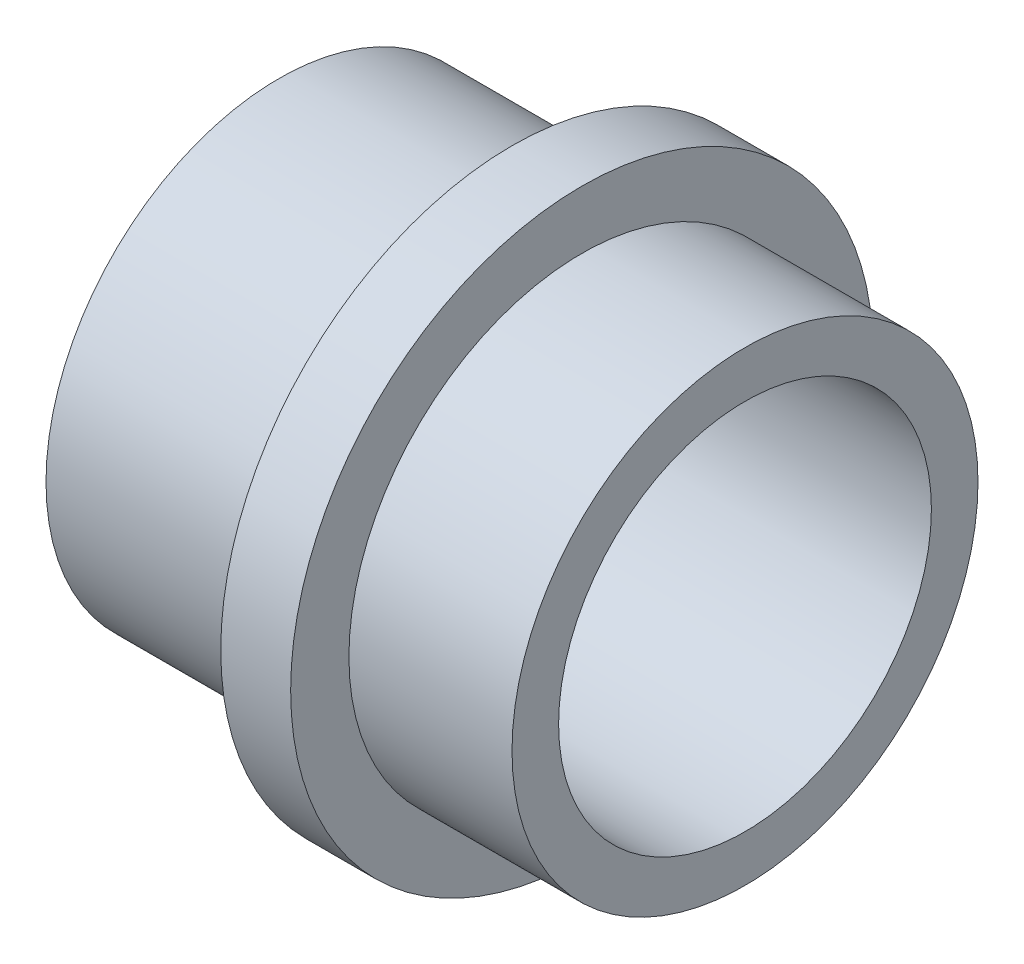
ISO-10303-21;
HEADER;
FILE_DESCRIPTION(('STEP AP214'),'2;1');
FILE_NAME('part.step','',(''),(''),'','','');
FILE_SCHEMA(('AUTOMOTIVE_DESIGN { 1 0 10303 214 1 1 1 1 }'));
ENDSEC;
DATA;
#1=APPLICATION_CONTEXT('core data for automotive mechanical design processes');
#2=APPLICATION_PROTOCOL_DEFINITION('international standard','automotive_design',2000,#1);
#3=PRODUCT_CONTEXT('',#1,'mechanical');
#4=PRODUCT('Part','Part','',(#3));
#5=PRODUCT_RELATED_PRODUCT_CATEGORY('part','',(#4));
#6=PRODUCT_DEFINITION_FORMATION('','',#4);
#7=PRODUCT_DEFINITION_CONTEXT('part definition',#1,'design');
#8=PRODUCT_DEFINITION('design','',#6,#7);
#9=PRODUCT_DEFINITION_SHAPE('','',#8);
#10=(LENGTH_UNIT() NAMED_UNIT(*) SI_UNIT(.MILLI.,.METRE.));
#11=(NAMED_UNIT(*) PLANE_ANGLE_UNIT() SI_UNIT($,.RADIAN.));
#12=(NAMED_UNIT(*) SI_UNIT($,.STERADIAN.) SOLID_ANGLE_UNIT());
#13=UNCERTAINTY_MEASURE_WITH_UNIT(LENGTH_MEASURE(1.E-05),#10,'distance_accuracy_value','');
#14=(GEOMETRIC_REPRESENTATION_CONTEXT(3) GLOBAL_UNCERTAINTY_ASSIGNED_CONTEXT((#13)) GLOBAL_UNIT_ASSIGNED_CONTEXT((#10,
#11,#12)) REPRESENTATION_CONTEXT('',''));
#15=CARTESIAN_POINT('',(0.,0.,0.));
#16=DIRECTION('',(0.,0.,1.));
#17=DIRECTION('',(1.,0.,0.));
#18=AXIS2_PLACEMENT_3D('',#15,#16,#17);
#19=CARTESIAN_POINT('',(2.54,0.,0.));
#20=DIRECTION('',(-1.,0.,0.));
#21=DIRECTION('',(0.,0.,1.));
#22=AXIS2_PLACEMENT_3D('',#19,#20,#21);
#23=CYLINDRICAL_SURFACE('',#22,1.27);
#24=CARTESIAN_POINT('',(1.27,0.,0.));
#25=DIRECTION('',(1.,0.,0.));
#26=DIRECTION('',(0.,0.,-1.));
#27=AXIS2_PLACEMENT_3D('',#24,#25,#26);
#28=CIRCLE('',#27,1.27);
#29=CARTESIAN_POINT('',(1.27,0.,-1.27));
#30=VERTEX_POINT('',#29);
#31=EDGE_CURVE('E54',#30,#30,#28,.T.);
#32=ORIENTED_EDGE('',*,*,#31,.F.);
#33=EDGE_LOOP('',(#32));
#34=FACE_BOUND('',#33,.T.);
#35=CARTESIAN_POINT('',(0.,0.,0.));
#36=DIRECTION('',(1.,0.,0.));
#37=DIRECTION('',(0.,0.,-1.));
#38=AXIS2_PLACEMENT_3D('',#35,#36,#37);
#39=CIRCLE('',#38,1.27);
#40=CARTESIAN_POINT('',(0.,0.,-1.27));
#41=VERTEX_POINT('',#40);
#42=EDGE_CURVE('E37',#41,#41,#39,.T.);
#43=ORIENTED_EDGE('',*,*,#42,.T.);
#44=EDGE_LOOP('',(#43));
#45=FACE_BOUND('',#44,.T.);
#46=ADVANCED_FACE('F33',(#34,#45),#23,.T.);
#47=CARTESIAN_POINT('',(0.,0.,0.));
#48=DIRECTION('',(1.,0.,0.));
#49=DIRECTION('',(0.,0.,-1.));
#50=AXIS2_PLACEMENT_3D('',#47,#48,#49);
#51=PLANE('',#50);
#52=CARTESIAN_POINT('',(0.,0.,0.));
#53=DIRECTION('',(1.,0.,0.));
#54=DIRECTION('',(0.,0.,-1.));
#55=AXIS2_PLACEMENT_3D('',#52,#53,#54);
#56=CIRCLE('',#55,1.016);
#57=CARTESIAN_POINT('',(0.,0.,-1.016));
#58=VERTEX_POINT('',#57);
#59=EDGE_CURVE('E57',#58,#58,#56,.T.);
#60=ORIENTED_EDGE('',*,*,#59,.T.);
#61=EDGE_LOOP('',(#60));
#62=FACE_BOUND('',#61,.T.);
#63=ORIENTED_EDGE('',*,*,#42,.F.);
#64=EDGE_LOOP('',(#63));
#65=FACE_BOUND('',#64,.T.);
#66=ADVANCED_FACE('F64',(#62,#65),#51,.F.);
#67=CARTESIAN_POINT('',(1.27,1.27,0.));
#68=DIRECTION('',(-1.,0.,0.));
#69=DIRECTION('',(0.,0.,1.));
#70=AXIS2_PLACEMENT_3D('',#67,#68,#69);
#71=PLANE('',#70);
#72=ORIENTED_EDGE('',*,*,#31,.T.);
#73=EDGE_LOOP('',(#72));
#74=FACE_BOUND('',#73,.T.);
#75=CARTESIAN_POINT('',(1.27,0.,0.));
#76=DIRECTION('',(1.,0.,0.));
#77=DIRECTION('',(0.,0.,-1.));
#78=AXIS2_PLACEMENT_3D('',#75,#76,#77);
#79=CIRCLE('',#78,1.5875);
#80=CARTESIAN_POINT('',(1.27,0.,-1.5875));
#81=VERTEX_POINT('',#80);
#82=EDGE_CURVE('E44',#81,#81,#79,.T.);
#83=ORIENTED_EDGE('',*,*,#82,.F.);
#84=EDGE_LOOP('',(#83));
#85=FACE_BOUND('',#84,.T.);
#86=ADVANCED_FACE('F91',(#74,#85),#71,.T.);
#87=CARTESIAN_POINT('',(2.54,0.,0.));
#88=DIRECTION('',(1.,0.,0.));
#89=DIRECTION('',(0.,0.,-1.));
#90=AXIS2_PLACEMENT_3D('',#87,#88,#89);
#91=CYLINDRICAL_SURFACE('',#90,1.5875);
#92=ORIENTED_EDGE('',*,*,#82,.T.);
#93=EDGE_LOOP('',(#92));
#94=FACE_BOUND('',#93,.T.);
#95=CARTESIAN_POINT('',(1.651,0.,0.));
#96=DIRECTION('',(1.,0.,0.));
#97=DIRECTION('',(0.,0.,-1.));
#98=AXIS2_PLACEMENT_3D('',#95,#96,#97);
#99=CIRCLE('',#98,1.5875);
#100=CARTESIAN_POINT('',(1.651,0.,-1.5875));
#101=VERTEX_POINT('',#100);
#102=EDGE_CURVE('E48',#101,#101,#99,.T.);
#103=ORIENTED_EDGE('',*,*,#102,.F.);
#104=EDGE_LOOP('',(#103));
#105=FACE_BOUND('',#104,.T.);
#106=ADVANCED_FACE('F82',(#94,#105),#91,.T.);
#107=CARTESIAN_POINT('',(1.651,1.27,0.));
#108=DIRECTION('',(1.,0.,0.));
#109=DIRECTION('',(0.,0.,-1.));
#110=AXIS2_PLACEMENT_3D('',#107,#108,#109);
#111=PLANE('',#110);
#112=ORIENTED_EDGE('',*,*,#102,.T.);
#113=EDGE_LOOP('',(#112));
#114=FACE_BOUND('',#113,.T.);
#115=CARTESIAN_POINT('',(1.651,0.,0.));
#116=DIRECTION('',(1.,0.,0.));
#117=DIRECTION('',(0.,0.,-1.));
#118=AXIS2_PLACEMENT_3D('',#115,#116,#117);
#119=CIRCLE('',#118,1.27);
#120=CARTESIAN_POINT('',(1.651,0.,-1.27));
#121=VERTEX_POINT('',#120);
#122=EDGE_CURVE('E51',#121,#121,#119,.T.);
#123=ORIENTED_EDGE('',*,*,#122,.F.);
#124=EDGE_LOOP('',(#123));
#125=FACE_BOUND('',#124,.T.);
#126=ADVANCED_FACE('F75',(#114,#125),#111,.T.);
#127=CARTESIAN_POINT('',(2.54,0.,0.));
#128=DIRECTION('',(1.,0.,0.));
#129=DIRECTION('',(0.,0.,-1.));
#130=AXIS2_PLACEMENT_3D('',#127,#128,#129);
#131=PLANE('',#130);
#132=CARTESIAN_POINT('',(2.54,0.,0.));
#133=DIRECTION('',(1.,0.,0.));
#134=DIRECTION('',(0.,0.,-1.));
#135=AXIS2_PLACEMENT_3D('',#132,#133,#134);
#136=CIRCLE('',#135,1.016);
#137=CARTESIAN_POINT('',(2.54,0.,-1.016));
#138=VERTEX_POINT('',#137);
#139=EDGE_CURVE('E58',#138,#138,#136,.T.);
#140=ORIENTED_EDGE('',*,*,#139,.F.);
#141=EDGE_LOOP('',(#140));
#142=FACE_BOUND('',#141,.T.);
#143=CARTESIAN_POINT('',(2.54,0.,0.));
#144=DIRECTION('',(1.,0.,0.));
#145=DIRECTION('',(0.,0.,-1.));
#146=AXIS2_PLACEMENT_3D('',#143,#144,#145);
#147=CIRCLE('',#146,1.27);
#148=CARTESIAN_POINT('',(2.54,0.,-1.27));
#149=VERTEX_POINT('',#148);
#150=EDGE_CURVE('E10',#149,#149,#147,.T.);
#151=ORIENTED_EDGE('',*,*,#150,.T.);
#152=EDGE_LOOP('',(#151));
#153=FACE_BOUND('',#152,.T.);
#154=ADVANCED_FACE('F73',(#142,#153),#131,.T.);
#155=ORIENTED_EDGE('',*,*,#122,.T.);
#156=EDGE_LOOP('',(#155));
#157=FACE_BOUND('',#156,.T.);
#158=ORIENTED_EDGE('',*,*,#150,.F.);
#159=EDGE_LOOP('',(#158));
#160=FACE_BOUND('',#159,.T.);
#161=ADVANCED_FACE('F35',(#157,#160),#23,.T.);
#162=CARTESIAN_POINT('',(0.,0.,0.));
#163=DIRECTION('',(1.,0.,0.));
#164=DIRECTION('',(0.,0.,-1.));
#165=AXIS2_PLACEMENT_3D('',#162,#163,#164);
#166=CYLINDRICAL_SURFACE('',#165,1.016);
#167=ORIENTED_EDGE('',*,*,#59,.F.);
#168=EDGE_LOOP('',(#167));
#169=FACE_BOUND('',#168,.T.);
#170=ORIENTED_EDGE('',*,*,#139,.T.);
#171=EDGE_LOOP('',(#170));
#172=FACE_BOUND('',#171,.T.);
#173=ADVANCED_FACE('F67',(#169,#172),#166,.F.);
#174=CLOSED_SHELL('',(#46,#66,#86,#106,#126,#154,#161,#173));
#175=MANIFOLD_SOLID_BREP('B2',#174);
#176=ADVANCED_BREP_SHAPE_REPRESENTATION('',(#18,#175),#14);
#177=SHAPE_DEFINITION_REPRESENTATION(#9,#176);
ENDSEC;
END-ISO-10303-21;
